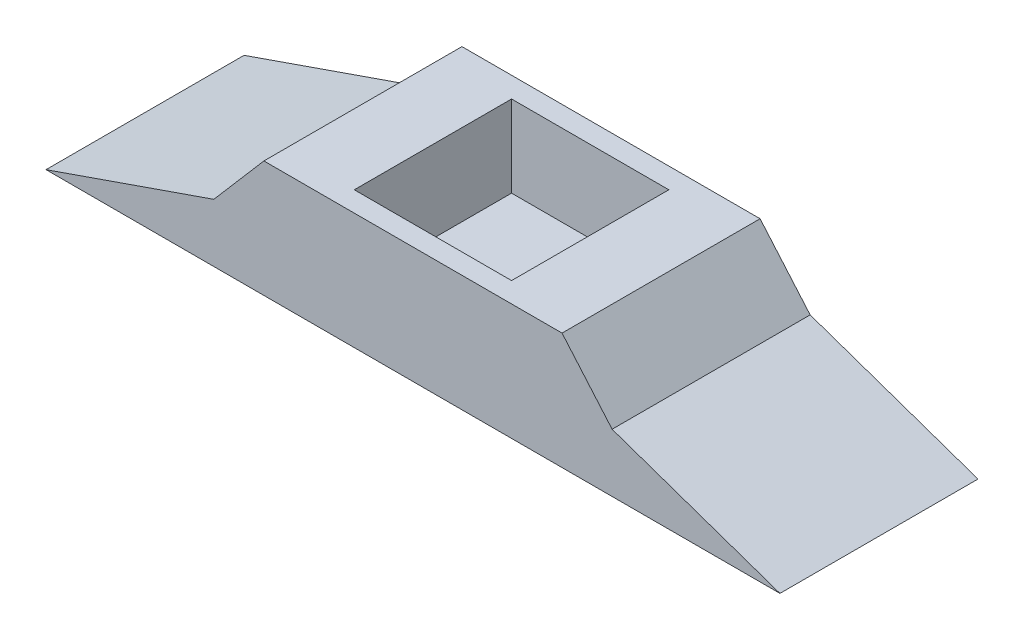
ISO-10303-21;
HEADER;
FILE_DESCRIPTION(('STEP AP214'),'2;1');
FILE_NAME('part.step','',(''),(''),'','','');
FILE_SCHEMA(('AUTOMOTIVE_DESIGN { 1 0 10303 214 1 1 1 1 }'));
ENDSEC;
DATA;
#1=APPLICATION_CONTEXT('core data for automotive mechanical design processes');
#2=APPLICATION_PROTOCOL_DEFINITION('international standard','automotive_design',2000,#1);
#3=PRODUCT_CONTEXT('',#1,'mechanical');
#4=PRODUCT('Part','Part','',(#3));
#5=PRODUCT_RELATED_PRODUCT_CATEGORY('part','',(#4));
#6=PRODUCT_DEFINITION_FORMATION('','',#4);
#7=PRODUCT_DEFINITION_CONTEXT('part definition',#1,'design');
#8=PRODUCT_DEFINITION('design','',#6,#7);
#9=PRODUCT_DEFINITION_SHAPE('','',#8);
#10=(LENGTH_UNIT() NAMED_UNIT(*) SI_UNIT(.MILLI.,.METRE.));
#11=(NAMED_UNIT(*) PLANE_ANGLE_UNIT() SI_UNIT($,.RADIAN.));
#12=(NAMED_UNIT(*) SI_UNIT($,.STERADIAN.) SOLID_ANGLE_UNIT());
#13=UNCERTAINTY_MEASURE_WITH_UNIT(LENGTH_MEASURE(1.E-05),#10,'distance_accuracy_value','');
#14=(GEOMETRIC_REPRESENTATION_CONTEXT(3) GLOBAL_UNCERTAINTY_ASSIGNED_CONTEXT((#13)) GLOBAL_UNIT_ASSIGNED_CONTEXT((#10,
#11,#12)) REPRESENTATION_CONTEXT('',''));
#15=CARTESIAN_POINT('',(0.,0.,0.));
#16=DIRECTION('',(0.,0.,1.));
#17=DIRECTION('',(1.,0.,0.));
#18=AXIS2_PLACEMENT_3D('',#15,#16,#17);
#19=CARTESIAN_POINT('',(-17.0976398314317,1.70328104898974,9.35310265789474));
#20=DIRECTION('',(-0.758386908236085,0.651804646666554,0.));
#21=DIRECTION('',(-0.651804646666554,-0.758386908236085,0.));
#22=AXIS2_PLACEMENT_3D('',#19,#20,#21);
#23=PLANE('',#22);
#24=DIRECTION('',(0.651804646666554,0.758386908236085,0.));
#25=VECTOR('',#24,1.);
#26=CARTESIAN_POINT('',(-17.0976398314317,1.70328104898974,-7.64689734210526));
#27=LINE('',#26,#25);
#28=CARTESIAN_POINT('',(-17.0976398314317,1.70328104898974,-7.64689734210526));
#29=VERTEX_POINT('',#28);
#30=CARTESIAN_POINT('',(-12.800330373766,6.70328104898974,-7.64689734210526));
#31=VERTEX_POINT('',#30);
#32=EDGE_CURVE('E131',#29,#31,#27,.T.);
#33=ORIENTED_EDGE('',*,*,#32,.F.);
#34=DIRECTION('',(0.,0.,-1.));
#35=VECTOR('',#34,1.);
#36=CARTESIAN_POINT('',(-17.0976398314317,1.70328104898974,9.35310265789474));
#37=LINE('',#36,#35);
#38=CARTESIAN_POINT('',(-17.0976398314317,1.70328104898974,9.35310265789474));
#39=VERTEX_POINT('',#38);
#40=EDGE_CURVE('E56',#39,#29,#37,.T.);
#41=ORIENTED_EDGE('',*,*,#40,.F.);
#42=DIRECTION('',(0.651804646666554,0.758386908236085,0.));
#43=VECTOR('',#42,1.);
#44=CARTESIAN_POINT('',(-17.0976398314317,1.70328104898974,9.35310265789474));
#45=LINE('',#44,#43);
#46=CARTESIAN_POINT('',(-12.800330373766,6.70328104898974,9.35310265789474));
#47=VERTEX_POINT('',#46);
#48=EDGE_CURVE('E147',#39,#47,#45,.T.);
#49=ORIENTED_EDGE('',*,*,#48,.T.);
#50=DIRECTION('',(0.,0.,-1.));
#51=VECTOR('',#50,1.);
#52=CARTESIAN_POINT('',(-12.800330373766,6.70328104898974,9.35310265789474));
#53=LINE('',#52,#51);
#54=EDGE_CURVE('E89',#47,#31,#53,.T.);
#55=ORIENTED_EDGE('',*,*,#54,.T.);
#56=EDGE_LOOP('',(#33,#41,#49,#55));
#57=FACE_BOUND('',#56,.T.);
#58=ADVANCED_FACE('F34',(#57),#23,.T.);
#59=CARTESIAN_POINT('',(-31.5047696172638,-3.29671895101026,9.35310265789474));
#60=DIRECTION('',(-0.327866816243545,0.944723954817661,0.));
#61=DIRECTION('',(-0.944723954817661,-0.327866816243545,0.));
#62=AXIS2_PLACEMENT_3D('',#59,#60,#61);
#63=PLANE('',#62);
#64=DIRECTION('',(0.944723954817661,0.327866816243545,0.));
#65=VECTOR('',#64,1.);
#66=CARTESIAN_POINT('',(-31.5047696172638,-3.29671895101026,-7.64689734210526));
#67=LINE('',#66,#65);
#68=CARTESIAN_POINT('',(-31.5047696172638,-3.29671895101026,-7.64689734210526));
#69=VERTEX_POINT('',#68);
#70=EDGE_CURVE('E144',#69,#29,#67,.T.);
#71=ORIENTED_EDGE('',*,*,#70,.F.);
#72=DIRECTION('',(0.,0.,-1.));
#73=VECTOR('',#72,1.);
#74=CARTESIAN_POINT('',(-31.5047696172638,-3.29671895101026,9.35310265789474));
#75=LINE('',#74,#73);
#76=CARTESIAN_POINT('',(-31.5047696172638,-3.29671895101026,9.35310265789474));
#77=VERTEX_POINT('',#76);
#78=EDGE_CURVE('E118',#77,#69,#75,.T.);
#79=ORIENTED_EDGE('',*,*,#78,.F.);
#80=DIRECTION('',(0.944723954817661,0.327866816243545,0.));
#81=VECTOR('',#80,1.);
#82=CARTESIAN_POINT('',(-31.5047696172638,-3.29671895101026,9.35310265789474));
#83=LINE('',#82,#81);
#84=EDGE_CURVE('E108',#77,#39,#83,.T.);
#85=ORIENTED_EDGE('',*,*,#84,.T.);
#86=ORIENTED_EDGE('',*,*,#40,.T.);
#87=EDGE_LOOP('',(#71,#79,#85,#86));
#88=FACE_BOUND('',#87,.T.);
#89=ADVANCED_FACE('F204',(#88),#63,.T.);
#90=CARTESIAN_POINT('',(-31.5047696172638,-3.29671895101026,9.35310265789474));
#91=DIRECTION('',(0.,1.,0.));
#92=DIRECTION('',(0.,0.,1.));
#93=AXIS2_PLACEMENT_3D('',#90,#91,#92);
#94=PLANE('',#93);
#95=DIRECTION('',(1.,0.,0.));
#96=VECTOR('',#95,1.);
#97=CARTESIAN_POINT('',(-31.5047696172638,-3.29671895101026,-7.64689734210526));
#98=LINE('',#97,#96);
#99=CARTESIAN_POINT('',(31.4952303827362,-3.29671895101026,-7.64689734210526));
#100=VERTEX_POINT('',#99);
#101=EDGE_CURVE('E115',#69,#100,#98,.T.);
#102=ORIENTED_EDGE('',*,*,#101,.T.);
#103=DIRECTION('',(0.,0.,-1.));
#104=VECTOR('',#103,1.);
#105=CARTESIAN_POINT('',(31.4952303827362,-3.29671895101026,9.35310265789474));
#106=LINE('',#105,#104);
#107=CARTESIAN_POINT('',(31.4952303827362,-3.29671895101026,9.35310265789474));
#108=VERTEX_POINT('',#107);
#109=EDGE_CURVE('E112',#108,#100,#106,.T.);
#110=ORIENTED_EDGE('',*,*,#109,.F.);
#111=DIRECTION('',(1.,0.,0.));
#112=VECTOR('',#111,1.);
#113=CARTESIAN_POINT('',(-31.5047696172638,-3.29671895101026,9.35310265789474));
#114=LINE('',#113,#112);
#115=EDGE_CURVE('E102',#77,#108,#114,.T.);
#116=ORIENTED_EDGE('',*,*,#115,.F.);
#117=ORIENTED_EDGE('',*,*,#78,.T.);
#118=EDGE_LOOP('',(#102,#110,#116,#117));
#119=FACE_BOUND('',#118,.T.);
#120=ADVANCED_FACE('F113',(#119),#94,.F.);
#121=CARTESIAN_POINT('',(31.4952303827362,-3.29671895101026,9.35310265789474));
#122=DIRECTION('',(-0.327866816243545,-0.944723954817661,0.));
#123=DIRECTION('',(0.944723954817661,-0.327866816243545,0.));
#124=AXIS2_PLACEMENT_3D('',#121,#122,#123);
#125=PLANE('',#124);
#126=DIRECTION('',(-0.944723954817661,0.327866816243545,0.));
#127=VECTOR('',#126,1.);
#128=CARTESIAN_POINT('',(31.4952303827362,-3.29671895101026,-7.64689734210526));
#129=LINE('',#128,#127);
#130=CARTESIAN_POINT('',(17.0881005969042,1.70328104898974,-7.64689734210526));
#131=VERTEX_POINT('',#130);
#132=EDGE_CURVE('E141',#100,#131,#129,.T.);
#133=ORIENTED_EDGE('',*,*,#132,.T.);
#134=DIRECTION('',(0.,0.,-1.));
#135=VECTOR('',#134,1.);
#136=CARTESIAN_POINT('',(17.0881005969042,1.70328104898974,9.35310265789474));
#137=LINE('',#136,#135);
#138=CARTESIAN_POINT('',(17.0881005969042,1.70328104898974,9.35310265789474));
#139=VERTEX_POINT('',#138);
#140=EDGE_CURVE('E119',#139,#131,#137,.T.);
#141=ORIENTED_EDGE('',*,*,#140,.F.);
#142=DIRECTION('',(-0.944723954817661,0.327866816243545,0.));
#143=VECTOR('',#142,1.);
#144=CARTESIAN_POINT('',(31.4952303827362,-3.29671895101026,9.35310265789474));
#145=LINE('',#144,#143);
#146=EDGE_CURVE('E106',#108,#139,#145,.T.);
#147=ORIENTED_EDGE('',*,*,#146,.F.);
#148=ORIENTED_EDGE('',*,*,#109,.T.);
#149=EDGE_LOOP('',(#133,#141,#147,#148));
#150=FACE_BOUND('',#149,.T.);
#151=ADVANCED_FACE('F121',(#150),#125,.F.);
#152=CARTESIAN_POINT('',(17.0881005969042,1.70328104898974,9.35310265789474));
#153=DIRECTION('',(-0.758386908236085,-0.651804646666554,0.));
#154=DIRECTION('',(0.651804646666554,-0.758386908236085,0.));
#155=AXIS2_PLACEMENT_3D('',#152,#153,#154);
#156=PLANE('',#155);
#157=DIRECTION('',(-0.651804646666554,0.758386908236085,0.));
#158=VECTOR('',#157,1.);
#159=CARTESIAN_POINT('',(17.0881005969042,1.70328104898974,-7.64689734210526));
#160=LINE('',#159,#158);
#161=CARTESIAN_POINT('',(12.7907911392385,6.70328104898974,-7.64689734210526));
#162=VERTEX_POINT('',#161);
#163=EDGE_CURVE('E138',#131,#162,#160,.T.);
#164=ORIENTED_EDGE('',*,*,#163,.T.);
#165=DIRECTION('',(0.,0.,-1.));
#166=VECTOR('',#165,1.);
#167=CARTESIAN_POINT('',(12.7907911392385,6.70328104898974,9.35310265789474));
#168=LINE('',#167,#166);
#169=CARTESIAN_POINT('',(12.7907911392385,6.70328104898974,9.35310265789474));
#170=VERTEX_POINT('',#169);
#171=EDGE_CURVE('E152',#170,#162,#168,.T.);
#172=ORIENTED_EDGE('',*,*,#171,.F.);
#173=DIRECTION('',(-0.651804646666554,0.758386908236085,0.));
#174=VECTOR('',#173,1.);
#175=CARTESIAN_POINT('',(17.0881005969042,1.70328104898974,9.35310265789474));
#176=LINE('',#175,#174);
#177=EDGE_CURVE('E124',#139,#170,#176,.T.);
#178=ORIENTED_EDGE('',*,*,#177,.F.);
#179=ORIENTED_EDGE('',*,*,#140,.T.);
#180=EDGE_LOOP('',(#164,#172,#178,#179));
#181=FACE_BOUND('',#180,.T.);
#182=ADVANCED_FACE('F217',(#181),#156,.F.);
#183=CARTESIAN_POINT('',(-12.800330373766,6.70328104898974,9.35310265789474));
#184=DIRECTION('',(0.,1.,0.));
#185=DIRECTION('',(0.,0.,1.));
#186=AXIS2_PLACEMENT_3D('',#183,#184,#185);
#187=PLANE('',#186);
#188=DIRECTION('',(0.,0.,-1.));
#189=VECTOR('',#188,1.);
#190=CARTESIAN_POINT('',(6.72281842363411,6.70328104898974,9.35310265789474));
#191=LINE('',#190,#189);
#192=CARTESIAN_POINT('',(6.72281842363411,6.70328104898974,7.6176817400305));
#193=VERTEX_POINT('',#192);
#194=CARTESIAN_POINT('',(6.72281842363411,6.70328104898974,-5.8823182599695));
#195=VERTEX_POINT('',#194);
#196=EDGE_CURVE('E11',#193,#195,#191,.T.);
#197=ORIENTED_EDGE('',*,*,#196,.F.);
#198=DIRECTION('',(1.,0.,0.));
#199=VECTOR('',#198,1.);
#200=CARTESIAN_POINT('',(-12.800330373766,6.70328104898974,7.6176817400305));
#201=LINE('',#200,#199);
#202=CARTESIAN_POINT('',(-6.77718157636589,6.70328104898974,7.6176817400305));
#203=VERTEX_POINT('',#202);
#204=EDGE_CURVE('E41',#203,#193,#201,.T.);
#205=ORIENTED_EDGE('',*,*,#204,.F.);
#206=DIRECTION('',(0.,0.,1.));
#207=VECTOR('',#206,1.);
#208=CARTESIAN_POINT('',(-6.77718157636589,6.70328104898974,9.35310265789474));
#209=LINE('',#208,#207);
#210=CARTESIAN_POINT('',(-6.77718157636589,6.70328104898974,-5.8823182599695));
#211=VERTEX_POINT('',#210);
#212=EDGE_CURVE('E156',#211,#203,#209,.T.);
#213=ORIENTED_EDGE('',*,*,#212,.F.);
#214=DIRECTION('',(-1.,0.,0.));
#215=VECTOR('',#214,1.);
#216=CARTESIAN_POINT('',(-12.800330373766,6.70328104898974,-5.8823182599695));
#217=LINE('',#216,#215);
#218=EDGE_CURVE('E149',#195,#211,#217,.T.);
#219=ORIENTED_EDGE('',*,*,#218,.F.);
#220=EDGE_LOOP('',(#197,#205,#213,#219));
#221=FACE_BOUND('',#220,.T.);
#222=DIRECTION('',(1.,0.,0.));
#223=VECTOR('',#222,1.);
#224=CARTESIAN_POINT('',(-12.800330373766,6.70328104898974,-7.64689734210526));
#225=LINE('',#224,#223);
#226=EDGE_CURVE('E134',#31,#162,#225,.T.);
#227=ORIENTED_EDGE('',*,*,#226,.F.);
#228=ORIENTED_EDGE('',*,*,#54,.F.);
#229=DIRECTION('',(1.,0.,0.));
#230=VECTOR('',#229,1.);
#231=CARTESIAN_POINT('',(-12.800330373766,6.70328104898974,9.35310265789474));
#232=LINE('',#231,#230);
#233=EDGE_CURVE('E126',#47,#170,#232,.T.);
#234=ORIENTED_EDGE('',*,*,#233,.T.);
#235=ORIENTED_EDGE('',*,*,#171,.T.);
#236=EDGE_LOOP('',(#227,#228,#234,#235));
#237=FACE_BOUND('',#236,.T.);
#238=ADVANCED_FACE('F181',(#221,#237),#187,.T.);
#239=CARTESIAN_POINT('',(-0.00476961726378775,-3.29671895101026,9.35310265789474));
#240=DIRECTION('',(0.,0.,1.));
#241=DIRECTION('',(1.,0.,0.));
#242=AXIS2_PLACEMENT_3D('',#239,#240,#241);
#243=PLANE('',#242);
#244=ORIENTED_EDGE('',*,*,#48,.F.);
#245=ORIENTED_EDGE('',*,*,#84,.F.);
#246=ORIENTED_EDGE('',*,*,#115,.T.);
#247=ORIENTED_EDGE('',*,*,#146,.T.);
#248=ORIENTED_EDGE('',*,*,#177,.T.);
#249=ORIENTED_EDGE('',*,*,#233,.F.);
#250=EDGE_LOOP('',(#244,#245,#246,#247,#248,#249));
#251=FACE_BOUND('',#250,.T.);
#252=ADVANCED_FACE('F104',(#251),#243,.T.);
#253=CARTESIAN_POINT('',(-0.00476961726378775,-3.29671895101026,-7.64689734210526));
#254=DIRECTION('',(0.,0.,1.));
#255=DIRECTION('',(1.,0.,0.));
#256=AXIS2_PLACEMENT_3D('',#253,#254,#255);
#257=PLANE('',#256);
#258=ORIENTED_EDGE('',*,*,#32,.T.);
#259=ORIENTED_EDGE('',*,*,#226,.T.);
#260=ORIENTED_EDGE('',*,*,#163,.F.);
#261=ORIENTED_EDGE('',*,*,#132,.F.);
#262=ORIENTED_EDGE('',*,*,#101,.F.);
#263=ORIENTED_EDGE('',*,*,#70,.T.);
#264=EDGE_LOOP('',(#258,#259,#260,#261,#262,#263));
#265=FACE_BOUND('',#264,.T.);
#266=ADVANCED_FACE('F203',(#265),#257,.F.);
#267=CARTESIAN_POINT('',(6.72281842363411,-0.296718951010264,7.6176817400305));
#268=DIRECTION('',(1.,0.,0.));
#269=DIRECTION('',(0.,0.,-1.));
#270=AXIS2_PLACEMENT_3D('',#267,#268,#269);
#271=PLANE('',#270);
#272=ORIENTED_EDGE('',*,*,#196,.T.);
#273=DIRECTION('',(0.,1.,0.));
#274=VECTOR('',#273,1.);
#275=CARTESIAN_POINT('',(6.72281842363411,-0.296718951010264,-5.8823182599695));
#276=LINE('',#275,#274);
#277=CARTESIAN_POINT('',(6.72281842363411,-0.296718951010264,-5.8823182599695));
#278=VERTEX_POINT('',#277);
#279=EDGE_CURVE('E48',#278,#195,#276,.T.);
#280=ORIENTED_EDGE('',*,*,#279,.F.);
#281=DIRECTION('',(0.,0.,-1.));
#282=VECTOR('',#281,1.);
#283=CARTESIAN_POINT('',(6.72281842363411,-0.296718951010264,7.6176817400305));
#284=LINE('',#283,#282);
#285=CARTESIAN_POINT('',(6.72281842363411,-0.296718951010264,7.6176817400305));
#286=VERTEX_POINT('',#285);
#287=EDGE_CURVE('E178',#286,#278,#284,.T.);
#288=ORIENTED_EDGE('',*,*,#287,.F.);
#289=DIRECTION('',(0.,1.,0.));
#290=VECTOR('',#289,1.);
#291=CARTESIAN_POINT('',(6.72281842363411,-0.296718951010264,7.6176817400305));
#292=LINE('',#291,#290);
#293=EDGE_CURVE('E135',#286,#193,#292,.T.);
#294=ORIENTED_EDGE('',*,*,#293,.T.);
#295=EDGE_LOOP('',(#272,#280,#288,#294));
#296=FACE_BOUND('',#295,.T.);
#297=ADVANCED_FACE('F175',(#296),#271,.F.);
#298=CARTESIAN_POINT('',(-6.77718157636589,-0.296718951010264,7.6176817400305));
#299=DIRECTION('',(0.,0.,1.));
#300=DIRECTION('',(1.,0.,0.));
#301=AXIS2_PLACEMENT_3D('',#298,#299,#300);
#302=PLANE('',#301);
#303=ORIENTED_EDGE('',*,*,#204,.T.);
#304=ORIENTED_EDGE('',*,*,#293,.F.);
#305=DIRECTION('',(1.,0.,0.));
#306=VECTOR('',#305,1.);
#307=CARTESIAN_POINT('',(-6.77718157636589,-0.296718951010264,7.6176817400305));
#308=LINE('',#307,#306);
#309=CARTESIAN_POINT('',(-6.77718157636589,-0.296718951010264,7.6176817400305));
#310=VERTEX_POINT('',#309);
#311=EDGE_CURVE('E197',#310,#286,#308,.T.);
#312=ORIENTED_EDGE('',*,*,#311,.F.);
#313=DIRECTION('',(0.,1.,0.));
#314=VECTOR('',#313,1.);
#315=CARTESIAN_POINT('',(-6.77718157636589,-0.296718951010264,7.6176817400305));
#316=LINE('',#315,#314);
#317=EDGE_CURVE('E170',#310,#203,#316,.T.);
#318=ORIENTED_EDGE('',*,*,#317,.T.);
#319=EDGE_LOOP('',(#303,#304,#312,#318));
#320=FACE_BOUND('',#319,.T.);
#321=ADVANCED_FACE('F164',(#320),#302,.F.);
#322=CARTESIAN_POINT('',(-6.77718157636589,-0.296718951010264,7.6176817400305));
#323=DIRECTION('',(-1.,0.,0.));
#324=DIRECTION('',(0.,0.,1.));
#325=AXIS2_PLACEMENT_3D('',#322,#323,#324);
#326=PLANE('',#325);
#327=ORIENTED_EDGE('',*,*,#212,.T.);
#328=ORIENTED_EDGE('',*,*,#317,.F.);
#329=DIRECTION('',(0.,0.,1.));
#330=VECTOR('',#329,1.);
#331=CARTESIAN_POINT('',(-6.77718157636589,-0.296718951010264,7.6176817400305));
#332=LINE('',#331,#330);
#333=CARTESIAN_POINT('',(-6.77718157636589,-0.296718951010264,-5.8823182599695));
#334=VERTEX_POINT('',#333);
#335=EDGE_CURVE('E193',#334,#310,#332,.T.);
#336=ORIENTED_EDGE('',*,*,#335,.F.);
#337=DIRECTION('',(0.,1.,0.));
#338=VECTOR('',#337,1.);
#339=CARTESIAN_POINT('',(-6.77718157636589,-0.296718951010264,-5.8823182599695));
#340=LINE('',#339,#338);
#341=EDGE_CURVE('E187',#334,#211,#340,.T.);
#342=ORIENTED_EDGE('',*,*,#341,.T.);
#343=EDGE_LOOP('',(#327,#328,#336,#342));
#344=FACE_BOUND('',#343,.T.);
#345=ADVANCED_FACE('F191',(#344),#326,.F.);
#346=CARTESIAN_POINT('',(-6.77718157636589,-0.296718951010264,-5.8823182599695));
#347=DIRECTION('',(0.,0.,-1.));
#348=DIRECTION('',(-1.,0.,0.));
#349=AXIS2_PLACEMENT_3D('',#346,#347,#348);
#350=PLANE('',#349);
#351=ORIENTED_EDGE('',*,*,#218,.T.);
#352=ORIENTED_EDGE('',*,*,#341,.F.);
#353=DIRECTION('',(-1.,0.,0.));
#354=VECTOR('',#353,1.);
#355=CARTESIAN_POINT('',(-6.77718157636589,-0.296718951010264,-5.8823182599695));
#356=LINE('',#355,#354);
#357=EDGE_CURVE('E242',#278,#334,#356,.T.);
#358=ORIENTED_EDGE('',*,*,#357,.F.);
#359=ORIENTED_EDGE('',*,*,#279,.T.);
#360=EDGE_LOOP('',(#351,#352,#358,#359));
#361=FACE_BOUND('',#360,.T.);
#362=ADVANCED_FACE('F185',(#361),#350,.F.);
#363=CARTESIAN_POINT('',(-0.00476961726378775,-0.296718951010264,-7.64689734210526));
#364=DIRECTION('',(0.,-1.,0.));
#365=DIRECTION('',(0.,0.,-1.));
#366=AXIS2_PLACEMENT_3D('',#363,#364,#365);
#367=PLANE('',#366);
#368=ORIENTED_EDGE('',*,*,#287,.T.);
#369=ORIENTED_EDGE('',*,*,#357,.T.);
#370=ORIENTED_EDGE('',*,*,#335,.T.);
#371=ORIENTED_EDGE('',*,*,#311,.T.);
#372=EDGE_LOOP('',(#368,#369,#370,#371));
#373=FACE_BOUND('',#372,.T.);
#374=ADVANCED_FACE('F232',(#373),#367,.F.);
#375=CLOSED_SHELL('',(#58,#89,#120,#151,#182,#238,#252,#266,#297,#321,#345,#362,#374));
#376=MANIFOLD_SOLID_BREP('B2',#375);
#377=ADVANCED_BREP_SHAPE_REPRESENTATION('',(#18,#376),#14);
#378=SHAPE_DEFINITION_REPRESENTATION(#9,#377);
ENDSEC;
END-ISO-10303-21;
